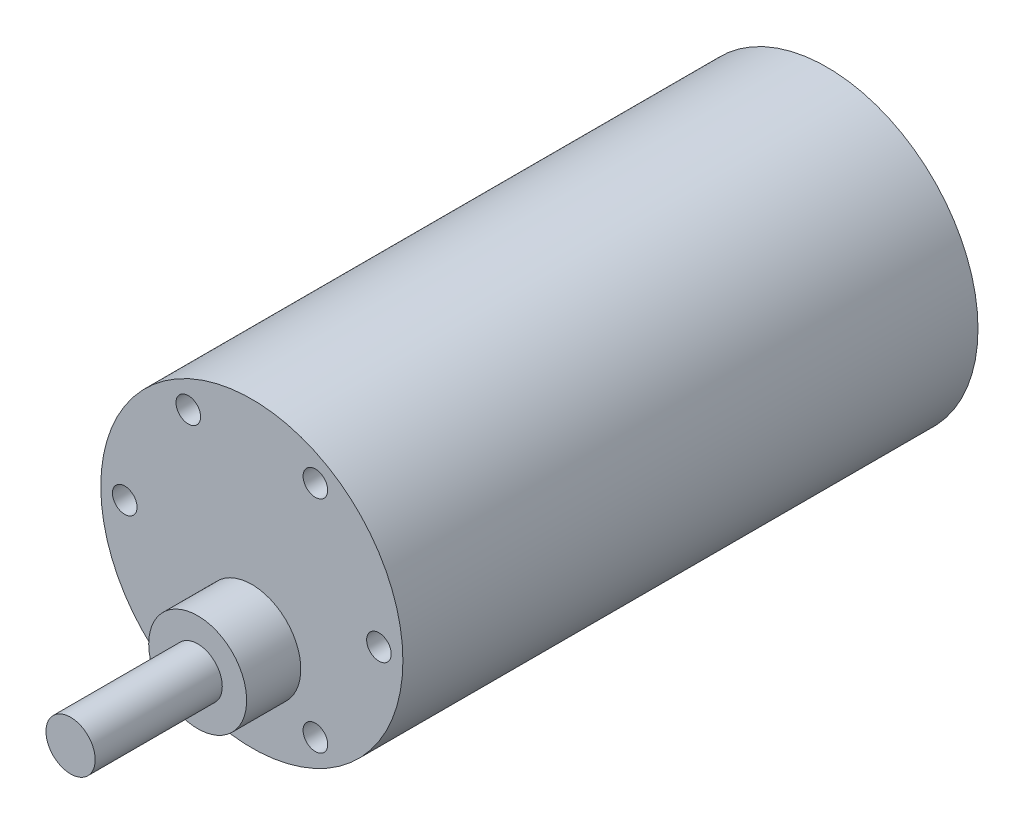
ISO-10303-21;
HEADER;
FILE_DESCRIPTION(('STEP AP214'),'2;1');
FILE_NAME('part.step','',(''),(''),'','','');
FILE_SCHEMA(('AUTOMOTIVE_DESIGN { 1 0 10303 214 1 1 1 1 }'));
ENDSEC;
DATA;
#1=APPLICATION_CONTEXT('core data for automotive mechanical design processes');
#2=APPLICATION_PROTOCOL_DEFINITION('international standard','automotive_design',2000,#1);
#3=PRODUCT_CONTEXT('',#1,'mechanical');
#4=PRODUCT('Part','Part','',(#3));
#5=PRODUCT_RELATED_PRODUCT_CATEGORY('part','',(#4));
#6=PRODUCT_DEFINITION_FORMATION('','',#4);
#7=PRODUCT_DEFINITION_CONTEXT('part definition',#1,'design');
#8=PRODUCT_DEFINITION('design','',#6,#7);
#9=PRODUCT_DEFINITION_SHAPE('','',#8);
#10=(LENGTH_UNIT() NAMED_UNIT(*) SI_UNIT(.MILLI.,.METRE.));
#11=(NAMED_UNIT(*) PLANE_ANGLE_UNIT() SI_UNIT($,.RADIAN.));
#12=(NAMED_UNIT(*) SI_UNIT($,.STERADIAN.) SOLID_ANGLE_UNIT());
#13=UNCERTAINTY_MEASURE_WITH_UNIT(LENGTH_MEASURE(1.E-05),#10,'distance_accuracy_value','');
#14=(GEOMETRIC_REPRESENTATION_CONTEXT(3) GLOBAL_UNCERTAINTY_ASSIGNED_CONTEXT((#13)) GLOBAL_UNIT_ASSIGNED_CONTEXT((#10,
#11,#12)) REPRESENTATION_CONTEXT('',''));
#15=CARTESIAN_POINT('',(0.,0.,0.));
#16=DIRECTION('',(0.,0.,1.));
#17=DIRECTION('',(1.,0.,0.));
#18=AXIS2_PLACEMENT_3D('',#15,#16,#17);
#19=CARTESIAN_POINT('',(0.,0.,70.104));
#20=DIRECTION('',(0.,0.,-1.));
#21=DIRECTION('',(-1.,0.,0.));
#22=AXIS2_PLACEMENT_3D('',#19,#20,#21);
#23=CYLINDRICAL_SURFACE('',#22,18.415);
#24=CARTESIAN_POINT('',(0.,0.,70.104));
#25=DIRECTION('',(0.,0.,1.));
#26=DIRECTION('',(1.,0.,0.));
#27=AXIS2_PLACEMENT_3D('',#24,#25,#26);
#28=CIRCLE('',#27,18.415);
#29=CARTESIAN_POINT('',(18.415,0.,70.104));
#30=VERTEX_POINT('',#29);
#31=EDGE_CURVE('E10',#30,#30,#28,.T.);
#32=ORIENTED_EDGE('',*,*,#31,.F.);
#33=EDGE_LOOP('',(#32));
#34=FACE_BOUND('',#33,.T.);
#35=CARTESIAN_POINT('',(0.,0.,0.));
#36=DIRECTION('',(0.,0.,1.));
#37=DIRECTION('',(1.,0.,0.));
#38=AXIS2_PLACEMENT_3D('',#35,#36,#37);
#39=CIRCLE('',#38,18.415);
#40=CARTESIAN_POINT('',(18.415,0.,0.));
#41=VERTEX_POINT('',#40);
#42=EDGE_CURVE('E34',#41,#41,#39,.T.);
#43=ORIENTED_EDGE('',*,*,#42,.T.);
#44=EDGE_LOOP('',(#43));
#45=FACE_BOUND('',#44,.T.);
#46=ADVANCED_FACE('F31',(#34,#45),#23,.T.);
#47=CARTESIAN_POINT('',(0.,0.,70.104));
#48=DIRECTION('',(0.,0.,1.));
#49=DIRECTION('',(1.,0.,0.));
#50=AXIS2_PLACEMENT_3D('',#47,#48,#49);
#51=PLANE('',#50);
#52=CARTESIAN_POINT('',(7.747,-13.4181976062361,70.104));
#53=DIRECTION('',(0.,0.,1.));
#54=DIRECTION('',(1.,0.,0.));
#55=AXIS2_PLACEMENT_3D('',#52,#53,#54);
#56=CIRCLE('',#55,1.5);
#57=CARTESIAN_POINT('',(9.247,-13.4181976062361,70.104));
#58=VERTEX_POINT('',#57);
#59=EDGE_CURVE('E73',#58,#58,#56,.T.);
#60=ORIENTED_EDGE('',*,*,#59,.F.);
#61=EDGE_LOOP('',(#60));
#62=FACE_BOUND('',#61,.T.);
#63=CARTESIAN_POINT('',(-7.747,-13.4181976062361,70.104));
#64=DIRECTION('',(0.,0.,1.));
#65=DIRECTION('',(1.,0.,0.));
#66=AXIS2_PLACEMENT_3D('',#63,#64,#65);
#67=CIRCLE('',#66,1.5);
#68=CARTESIAN_POINT('',(-6.247,-13.4181976062361,70.104));
#69=VERTEX_POINT('',#68);
#70=EDGE_CURVE('E79',#69,#69,#67,.T.);
#71=ORIENTED_EDGE('',*,*,#70,.F.);
#72=EDGE_LOOP('',(#71));
#73=FACE_BOUND('',#72,.T.);
#74=CARTESIAN_POINT('',(-7.747,13.4181976062361,70.104));
#75=DIRECTION('',(0.,0.,1.));
#76=DIRECTION('',(1.,0.,0.));
#77=AXIS2_PLACEMENT_3D('',#74,#75,#76);
#78=CIRCLE('',#77,1.5);
#79=CARTESIAN_POINT('',(-6.247,13.4181976062361,70.104));
#80=VERTEX_POINT('',#79);
#81=EDGE_CURVE('E85',#80,#80,#78,.T.);
#82=ORIENTED_EDGE('',*,*,#81,.F.);
#83=EDGE_LOOP('',(#82));
#84=FACE_BOUND('',#83,.T.);
#85=CARTESIAN_POINT('',(7.747,13.4181976062361,70.104));
#86=DIRECTION('',(0.,0.,1.));
#87=DIRECTION('',(1.,0.,0.));
#88=AXIS2_PLACEMENT_3D('',#85,#86,#87);
#89=CIRCLE('',#88,1.5);
#90=CARTESIAN_POINT('',(9.247,13.4181976062361,70.104));
#91=VERTEX_POINT('',#90);
#92=EDGE_CURVE('E61',#91,#91,#89,.T.);
#93=ORIENTED_EDGE('',*,*,#92,.F.);
#94=EDGE_LOOP('',(#93));
#95=FACE_BOUND('',#94,.T.);
#96=CARTESIAN_POINT('',(15.494,0.,70.104));
#97=DIRECTION('',(0.,0.,1.));
#98=DIRECTION('',(1.,0.,0.));
#99=AXIS2_PLACEMENT_3D('',#96,#97,#98);
#100=CIRCLE('',#99,1.5);
#101=CARTESIAN_POINT('',(16.994,0.,70.104));
#102=VERTEX_POINT('',#101);
#103=EDGE_CURVE('E68',#102,#102,#100,.T.);
#104=ORIENTED_EDGE('',*,*,#103,.F.);
#105=EDGE_LOOP('',(#104));
#106=FACE_BOUND('',#105,.T.);
#107=CARTESIAN_POINT('',(-15.494,0.,70.104));
#108=DIRECTION('',(0.,0.,1.));
#109=DIRECTION('',(1.,0.,0.));
#110=AXIS2_PLACEMENT_3D('',#107,#108,#109);
#111=CIRCLE('',#110,1.5);
#112=CARTESIAN_POINT('',(-13.994,0.,70.104));
#113=VERTEX_POINT('',#112);
#114=EDGE_CURVE('E55',#113,#113,#111,.T.);
#115=ORIENTED_EDGE('',*,*,#114,.F.);
#116=EDGE_LOOP('',(#115));
#117=FACE_BOUND('',#116,.T.);
#118=CARTESIAN_POINT('',(0.,-7.112,70.104));
#119=DIRECTION('',(0.,0.,1.));
#120=DIRECTION('',(1.,0.,0.));
#121=AXIS2_PLACEMENT_3D('',#118,#119,#120);
#122=CIRCLE('',#121,5.969);
#123=CARTESIAN_POINT('',(-5.969,-7.112,70.104));
#124=VERTEX_POINT('',#123);
#125=EDGE_CURVE('E43',#124,#124,#122,.T.);
#126=ORIENTED_EDGE('',*,*,#125,.F.);
#127=EDGE_LOOP('',(#126));
#128=FACE_BOUND('',#127,.T.);
#129=ORIENTED_EDGE('',*,*,#31,.T.);
#130=EDGE_LOOP('',(#129));
#131=FACE_BOUND('',#130,.T.);
#132=ADVANCED_FACE('F100',(#62,#73,#84,#95,#106,#117,#128,#131),#51,.T.);
#133=CARTESIAN_POINT('',(0.,0.,0.));
#134=DIRECTION('',(0.,0.,1.));
#135=DIRECTION('',(1.,0.,0.));
#136=AXIS2_PLACEMENT_3D('',#133,#134,#135);
#137=PLANE('',#136);
#138=ORIENTED_EDGE('',*,*,#42,.F.);
#139=EDGE_LOOP('',(#138));
#140=FACE_BOUND('',#139,.T.);
#141=ADVANCED_FACE('F103',(#140),#137,.F.);
#142=CARTESIAN_POINT('',(0.,-7.112,76.708));
#143=DIRECTION('',(0.,0.,-1.));
#144=DIRECTION('',(-1.,0.,0.));
#145=AXIS2_PLACEMENT_3D('',#142,#143,#144);
#146=CYLINDRICAL_SURFACE('',#145,5.969);
#147=CARTESIAN_POINT('',(0.,-7.112,76.708));
#148=DIRECTION('',(0.,0.,1.));
#149=DIRECTION('',(1.,0.,0.));
#150=AXIS2_PLACEMENT_3D('',#147,#148,#149);
#151=CIRCLE('',#150,5.969);
#152=CARTESIAN_POINT('',(-5.969,-7.112,76.708));
#153=VERTEX_POINT('',#152);
#154=EDGE_CURVE('E41',#153,#153,#151,.T.);
#155=CARTESIAN_POINT('',(-5.969,-7.112,76.708));
#156=CARTESIAN_POINT('',(-5.969,-7.112,76.6392083333333));
#157=CARTESIAN_POINT('',(-5.969,-7.112,76.5704166666666));
#158=CARTESIAN_POINT('',(-5.969,-7.112,76.4328333333333));
#159=CARTESIAN_POINT('',(-5.969,-7.112,76.3640416666667));
#160=CARTESIAN_POINT('',(-5.969,-7.112,76.2264583333333));
#161=CARTESIAN_POINT('',(-5.969,-7.112,76.1576666666666));
#162=CARTESIAN_POINT('',(-5.969,-7.112,76.0200833333333));
#163=CARTESIAN_POINT('',(-5.969,-7.112,75.9512916666666));
#164=CARTESIAN_POINT('',(-5.969,-7.112,75.8137083333333));
#165=CARTESIAN_POINT('',(-5.969,-7.112,75.7449166666667));
#166=CARTESIAN_POINT('',(-5.969,-7.112,75.6073333333333));
#167=CARTESIAN_POINT('',(-5.969,-7.112,75.5385416666666));
#168=CARTESIAN_POINT('',(-5.969,-7.112,75.4009583333333));
#169=CARTESIAN_POINT('',(-5.969,-7.112,75.3321666666666));
#170=CARTESIAN_POINT('',(-5.969,-7.112,75.1945833333333));
#171=CARTESIAN_POINT('',(-5.969,-7.112,75.1257916666666));
#172=CARTESIAN_POINT('',(-5.969,-7.112,74.9882083333333));
#173=CARTESIAN_POINT('',(-5.969,-7.112,74.9194166666666));
#174=CARTESIAN_POINT('',(-5.969,-7.112,74.7818333333333));
#175=CARTESIAN_POINT('',(-5.969,-7.112,74.7130416666666));
#176=CARTESIAN_POINT('',(-5.969,-7.112,74.5754583333333));
#177=CARTESIAN_POINT('',(-5.969,-7.112,74.5066666666666));
#178=CARTESIAN_POINT('',(-5.969,-7.112,74.3690833333333));
#179=CARTESIAN_POINT('',(-5.969,-7.112,74.3002916666666));
#180=CARTESIAN_POINT('',(-5.969,-7.112,74.1627083333333));
#181=CARTESIAN_POINT('',(-5.969,-7.112,74.0939166666666));
#182=CARTESIAN_POINT('',(-5.969,-7.112,73.9563333333333));
#183=CARTESIAN_POINT('',(-5.969,-7.112,73.8875416666666));
#184=CARTESIAN_POINT('',(-5.969,-7.112,73.7499583333333));
#185=CARTESIAN_POINT('',(-5.969,-7.112,73.6811666666666));
#186=CARTESIAN_POINT('',(-5.969,-7.112,73.5435833333333));
#187=CARTESIAN_POINT('',(-5.969,-7.112,73.4747916666666));
#188=CARTESIAN_POINT('',(-5.969,-7.112,73.3372083333333));
#189=CARTESIAN_POINT('',(-5.969,-7.112,73.2684166666666));
#190=CARTESIAN_POINT('',(-5.969,-7.112,73.1308333333333));
#191=CARTESIAN_POINT('',(-5.969,-7.112,73.0620416666666));
#192=CARTESIAN_POINT('',(-5.969,-7.112,72.9244583333333));
#193=CARTESIAN_POINT('',(-5.969,-7.112,72.8556666666666));
#194=CARTESIAN_POINT('',(-5.969,-7.112,72.7180833333333));
#195=CARTESIAN_POINT('',(-5.969,-7.112,72.6492916666666));
#196=CARTESIAN_POINT('',(-5.969,-7.112,72.5117083333333));
#197=CARTESIAN_POINT('',(-5.969,-7.112,72.4429166666666));
#198=CARTESIAN_POINT('',(-5.969,-7.112,72.3053333333333));
#199=CARTESIAN_POINT('',(-5.969,-7.112,72.2365416666666));
#200=CARTESIAN_POINT('',(-5.969,-7.112,72.0989583333333));
#201=CARTESIAN_POINT('',(-5.969,-7.112,72.0301666666666));
#202=CARTESIAN_POINT('',(-5.969,-7.112,71.8925833333333));
#203=CARTESIAN_POINT('',(-5.969,-7.112,71.8237916666667));
#204=CARTESIAN_POINT('',(-5.969,-7.112,71.6862083333333));
#205=CARTESIAN_POINT('',(-5.969,-7.112,71.6174166666666));
#206=CARTESIAN_POINT('',(-5.969,-7.112,71.4798333333333));
#207=CARTESIAN_POINT('',(-5.969,-7.112,71.4110416666666));
#208=CARTESIAN_POINT('',(-5.969,-7.112,71.2734583333333));
#209=CARTESIAN_POINT('',(-5.969,-7.112,71.2046666666666));
#210=CARTESIAN_POINT('',(-5.969,-7.112,71.0670833333333));
#211=CARTESIAN_POINT('',(-5.969,-7.112,70.9982916666666));
#212=CARTESIAN_POINT('',(-5.969,-7.112,70.8607083333333));
#213=CARTESIAN_POINT('',(-5.969,-7.112,70.7919166666667));
#214=CARTESIAN_POINT('',(-5.969,-7.112,70.6543333333333));
#215=CARTESIAN_POINT('',(-5.969,-7.112,70.5855416666666));
#216=CARTESIAN_POINT('',(-5.969,-7.112,70.4479583333333));
#217=CARTESIAN_POINT('',(-5.969,-7.112,70.3791666666666));
#218=CARTESIAN_POINT('',(-5.969,-7.112,70.2415833333333));
#219=CARTESIAN_POINT('',(-5.969,-7.112,70.1727916666667));
#220=CARTESIAN_POINT('',(-5.969,-7.112,70.104));
#221=B_SPLINE_CURVE_WITH_KNOTS('',3,(#155,#156,#157,#158,#159,#160,#161,#162,#163,#164,#165,
#166,#167,#168,#169,#170,#171,#172,#173,#174,#175,#176,#177,#178,#179,#180,#181,#182,#183,#184,
#185,#186,#187,#188,#189,#190,#191,#192,#193,#194,#195,#196,#197,#198,#199,#200,#201,#202,#203,
#204,#205,#206,#207,#208,#209,#210,#211,#212,#213,#214,#215,#216,#217,#218,#219,#220),
.UNSPECIFIED.,.F.,.F.,(4,2,2,2,2,2,2,2,2,2,2,2,2,2,2,2,2,2,2,2,2,2,2,2,2,2,2,2,2,2,2,2,4),(0.,
0.206375000000009,0.412750000000003,0.619125000000012,0.825500000000007,1.031875,
1.23825000000001,1.444625,1.651,1.85737500000001,2.06375,2.27012500000001,2.47650000000001,
2.682875,2.88925000000001,3.095625,3.302,3.50837500000001,3.71475,3.92112500000001,
4.12750000000001,4.333875,4.54025000000001,4.746625,4.953,5.15937500000001,5.36575,
5.57212500000001,5.77850000000001,5.984875,6.19125000000001,6.397625,6.604),.UNSPECIFIED.);
#222=EDGE_CURVE('BSEAM114',#153,#124,#221,.T.);
#223=ORIENTED_EDGE('',*,*,#154,.F.);
#224=ORIENTED_EDGE('',*,*,#125,.T.);
#225=ORIENTED_EDGE('',*,*,#222,.T.);
#226=ORIENTED_EDGE('',*,*,#222,.F.);
#227=EDGE_LOOP('',(#223,#225,#224,#226));
#228=FACE_BOUND('',#227,.T.);
#229=ADVANCED_FACE('F114',(#228),#146,.T.);
#230=CARTESIAN_POINT('',(0.,-7.112,76.708));
#231=DIRECTION('',(0.,0.,1.));
#232=DIRECTION('',(1.,0.,0.));
#233=AXIS2_PLACEMENT_3D('',#230,#231,#232);
#234=PLANE('',#233);
#235=CARTESIAN_POINT('',(0.,-7.112,76.708));
#236=DIRECTION('',(0.,0.,1.));
#237=DIRECTION('',(1.,0.,0.));
#238=AXIS2_PLACEMENT_3D('',#235,#236,#237);
#239=CIRCLE('',#238,3.);
#240=CARTESIAN_POINT('',(3.,-7.112,76.708));
#241=VERTEX_POINT('',#240);
#242=EDGE_CURVE('E49',#241,#241,#239,.T.);
#243=ORIENTED_EDGE('',*,*,#242,.F.);
#244=EDGE_LOOP('',(#243));
#245=FACE_BOUND('',#244,.T.);
#246=ORIENTED_EDGE('',*,*,#154,.T.);
#247=EDGE_LOOP('',(#246));
#248=FACE_BOUND('',#247,.T.);
#249=ADVANCED_FACE('F116',(#245,#248),#234,.T.);
#250=CARTESIAN_POINT('',(0.,-7.112,92.202));
#251=DIRECTION('',(0.,0.,-1.));
#252=DIRECTION('',(-1.,0.,0.));
#253=AXIS2_PLACEMENT_3D('',#250,#251,#252);
#254=CYLINDRICAL_SURFACE('',#253,3.);
#255=CARTESIAN_POINT('',(0.,-7.112,92.202));
#256=DIRECTION('',(0.,0.,1.));
#257=DIRECTION('',(1.,0.,0.));
#258=AXIS2_PLACEMENT_3D('',#255,#256,#257);
#259=CIRCLE('',#258,3.);
#260=CARTESIAN_POINT('',(3.,-7.112,92.202));
#261=VERTEX_POINT('',#260);
#262=EDGE_CURVE('E46',#261,#261,#259,.T.);
#263=ORIENTED_EDGE('',*,*,#262,.F.);
#264=EDGE_LOOP('',(#263));
#265=FACE_BOUND('',#264,.T.);
#266=ORIENTED_EDGE('',*,*,#242,.T.);
#267=EDGE_LOOP('',(#266));
#268=FACE_BOUND('',#267,.T.);
#269=ADVANCED_FACE('F123',(#265,#268),#254,.T.);
#270=CARTESIAN_POINT('',(0.,-7.112,92.202));
#271=DIRECTION('',(0.,0.,1.));
#272=DIRECTION('',(1.,0.,0.));
#273=AXIS2_PLACEMENT_3D('',#270,#271,#272);
#274=PLANE('',#273);
#275=ORIENTED_EDGE('',*,*,#262,.T.);
#276=EDGE_LOOP('',(#275));
#277=FACE_BOUND('',#276,.T.);
#278=ADVANCED_FACE('F162',(#277),#274,.T.);
#279=CARTESIAN_POINT('',(-15.494,0.,44.704));
#280=DIRECTION('',(0.,0.,1.));
#281=DIRECTION('',(1.,0.,0.));
#282=AXIS2_PLACEMENT_3D('',#279,#280,#281);
#283=CYLINDRICAL_SURFACE('',#282,1.5);
#284=CARTESIAN_POINT('',(-15.494,0.,44.704));
#285=DIRECTION('',(0.,0.,1.));
#286=DIRECTION('',(1.,0.,0.));
#287=AXIS2_PLACEMENT_3D('',#284,#285,#286);
#288=CIRCLE('',#287,1.5);
#289=CARTESIAN_POINT('',(-13.994,0.,44.704));
#290=VERTEX_POINT('',#289);
#291=EDGE_CURVE('E52',#290,#290,#288,.T.);
#292=ORIENTED_EDGE('',*,*,#291,.F.);
#293=EDGE_LOOP('',(#292));
#294=FACE_BOUND('',#293,.T.);
#295=ORIENTED_EDGE('',*,*,#114,.T.);
#296=EDGE_LOOP('',(#295));
#297=FACE_BOUND('',#296,.T.);
#298=ADVANCED_FACE('F171',(#294,#297),#283,.F.);
#299=CARTESIAN_POINT('',(-15.494,0.,44.704));
#300=DIRECTION('',(0.,0.,1.));
#301=DIRECTION('',(1.,0.,0.));
#302=AXIS2_PLACEMENT_3D('',#299,#300,#301);
#303=PLANE('',#302);
#304=ORIENTED_EDGE('',*,*,#291,.T.);
#305=EDGE_LOOP('',(#304));
#306=FACE_BOUND('',#305,.T.);
#307=ADVANCED_FACE('F181',(#306),#303,.T.);
#308=CARTESIAN_POINT('',(15.494,0.,44.704));
#309=DIRECTION('',(0.,0.,1.));
#310=DIRECTION('',(1.,0.,0.));
#311=AXIS2_PLACEMENT_3D('',#308,#309,#310);
#312=CYLINDRICAL_SURFACE('',#311,1.5);
#313=CARTESIAN_POINT('',(15.494,0.,44.704));
#314=DIRECTION('',(0.,0.,1.));
#315=DIRECTION('',(1.,0.,0.));
#316=AXIS2_PLACEMENT_3D('',#313,#314,#315);
#317=CIRCLE('',#316,1.5);
#318=CARTESIAN_POINT('',(16.994,0.,44.704));
#319=VERTEX_POINT('',#318);
#320=EDGE_CURVE('E58',#319,#319,#317,.T.);
#321=ORIENTED_EDGE('',*,*,#320,.F.);
#322=EDGE_LOOP('',(#321));
#323=FACE_BOUND('',#322,.T.);
#324=ORIENTED_EDGE('',*,*,#103,.T.);
#325=EDGE_LOOP('',(#324));
#326=FACE_BOUND('',#325,.T.);
#327=ADVANCED_FACE('F188',(#323,#326),#312,.F.);
#328=CARTESIAN_POINT('',(15.494,0.,44.704));
#329=DIRECTION('',(0.,0.,1.));
#330=DIRECTION('',(1.,0.,0.));
#331=AXIS2_PLACEMENT_3D('',#328,#329,#330);
#332=PLANE('',#331);
#333=ORIENTED_EDGE('',*,*,#320,.T.);
#334=EDGE_LOOP('',(#333));
#335=FACE_BOUND('',#334,.T.);
#336=ADVANCED_FACE('F196',(#335),#332,.T.);
#337=CARTESIAN_POINT('',(7.747,13.4181976062361,44.704));
#338=DIRECTION('',(0.,0.,1.));
#339=DIRECTION('',(1.,0.,0.));
#340=AXIS2_PLACEMENT_3D('',#337,#338,#339);
#341=CYLINDRICAL_SURFACE('',#340,1.5);
#342=CARTESIAN_POINT('',(7.747,13.4181976062361,44.704));
#343=DIRECTION('',(0.,0.,1.));
#344=DIRECTION('',(1.,0.,0.));
#345=AXIS2_PLACEMENT_3D('',#342,#343,#344);
#346=CIRCLE('',#345,1.5);
#347=CARTESIAN_POINT('',(9.247,13.4181976062361,44.704));
#348=VERTEX_POINT('',#347);
#349=EDGE_CURVE('E64',#348,#348,#346,.T.);
#350=ORIENTED_EDGE('',*,*,#349,.F.);
#351=EDGE_LOOP('',(#350));
#352=FACE_BOUND('',#351,.T.);
#353=ORIENTED_EDGE('',*,*,#92,.T.);
#354=EDGE_LOOP('',(#353));
#355=FACE_BOUND('',#354,.T.);
#356=ADVANCED_FACE('F204',(#352,#355),#341,.F.);
#357=CARTESIAN_POINT('',(7.747,13.4181976062361,44.704));
#358=DIRECTION('',(0.,0.,1.));
#359=DIRECTION('',(1.,0.,0.));
#360=AXIS2_PLACEMENT_3D('',#357,#358,#359);
#361=PLANE('',#360);
#362=ORIENTED_EDGE('',*,*,#349,.T.);
#363=EDGE_LOOP('',(#362));
#364=FACE_BOUND('',#363,.T.);
#365=ADVANCED_FACE('F96',(#364),#361,.T.);
#366=CARTESIAN_POINT('',(-7.747,13.4181976062361,44.704));
#367=DIRECTION('',(0.,0.,1.));
#368=DIRECTION('',(1.,0.,0.));
#369=AXIS2_PLACEMENT_3D('',#366,#367,#368);
#370=CYLINDRICAL_SURFACE('',#369,1.5);
#371=CARTESIAN_POINT('',(-7.747,13.4181976062361,44.704));
#372=DIRECTION('',(0.,0.,1.));
#373=DIRECTION('',(1.,0.,0.));
#374=AXIS2_PLACEMENT_3D('',#371,#372,#373);
#375=CIRCLE('',#374,1.5);
#376=CARTESIAN_POINT('',(-6.247,13.4181976062361,44.704));
#377=VERTEX_POINT('',#376);
#378=EDGE_CURVE('E65',#377,#377,#375,.T.);
#379=ORIENTED_EDGE('',*,*,#378,.F.);
#380=EDGE_LOOP('',(#379));
#381=FACE_BOUND('',#380,.T.);
#382=ORIENTED_EDGE('',*,*,#81,.T.);
#383=EDGE_LOOP('',(#382));
#384=FACE_BOUND('',#383,.T.);
#385=ADVANCED_FACE('F93',(#381,#384),#370,.F.);
#386=CARTESIAN_POINT('',(-7.747,13.4181976062361,44.704));
#387=DIRECTION('',(0.,0.,1.));
#388=DIRECTION('',(1.,0.,0.));
#389=AXIS2_PLACEMENT_3D('',#386,#387,#388);
#390=PLANE('',#389);
#391=ORIENTED_EDGE('',*,*,#378,.T.);
#392=EDGE_LOOP('',(#391));
#393=FACE_BOUND('',#392,.T.);
#394=ADVANCED_FACE('F91',(#393),#390,.T.);
#395=CARTESIAN_POINT('',(-7.747,-13.4181976062361,44.704));
#396=DIRECTION('',(0.,0.,1.));
#397=DIRECTION('',(1.,0.,0.));
#398=AXIS2_PLACEMENT_3D('',#395,#396,#397);
#399=CYLINDRICAL_SURFACE('',#398,1.5);
#400=CARTESIAN_POINT('',(-7.747,-13.4181976062361,44.704));
#401=DIRECTION('',(0.,0.,1.));
#402=DIRECTION('',(1.,0.,0.));
#403=AXIS2_PLACEMENT_3D('',#400,#401,#402);
#404=CIRCLE('',#403,1.5);
#405=CARTESIAN_POINT('',(-6.247,-13.4181976062361,44.704));
#406=VERTEX_POINT('',#405);
#407=EDGE_CURVE('E82',#406,#406,#404,.T.);
#408=ORIENTED_EDGE('',*,*,#407,.F.);
#409=EDGE_LOOP('',(#408));
#410=FACE_BOUND('',#409,.T.);
#411=ORIENTED_EDGE('',*,*,#70,.T.);
#412=EDGE_LOOP('',(#411));
#413=FACE_BOUND('',#412,.T.);
#414=ADVANCED_FACE('F230',(#410,#413),#399,.F.);
#415=CARTESIAN_POINT('',(-7.747,-13.4181976062361,44.704));
#416=DIRECTION('',(0.,0.,1.));
#417=DIRECTION('',(1.,0.,0.));
#418=AXIS2_PLACEMENT_3D('',#415,#416,#417);
#419=PLANE('',#418);
#420=ORIENTED_EDGE('',*,*,#407,.T.);
#421=EDGE_LOOP('',(#420));
#422=FACE_BOUND('',#421,.T.);
#423=ADVANCED_FACE('F237',(#422),#419,.T.);
#424=CARTESIAN_POINT('',(7.747,-13.4181976062361,44.704));
#425=DIRECTION('',(0.,0.,1.));
#426=DIRECTION('',(1.,0.,0.));
#427=AXIS2_PLACEMENT_3D('',#424,#425,#426);
#428=CYLINDRICAL_SURFACE('',#427,1.5);
#429=CARTESIAN_POINT('',(7.747,-13.4181976062361,44.704));
#430=DIRECTION('',(0.,0.,1.));
#431=DIRECTION('',(1.,0.,0.));
#432=AXIS2_PLACEMENT_3D('',#429,#430,#431);
#433=CIRCLE('',#432,1.5);
#434=CARTESIAN_POINT('',(9.247,-13.4181976062361,44.704));
#435=VERTEX_POINT('',#434);
#436=EDGE_CURVE('E76',#435,#435,#433,.T.);
#437=ORIENTED_EDGE('',*,*,#436,.F.);
#438=EDGE_LOOP('',(#437));
#439=FACE_BOUND('',#438,.T.);
#440=ORIENTED_EDGE('',*,*,#59,.T.);
#441=EDGE_LOOP('',(#440));
#442=FACE_BOUND('',#441,.T.);
#443=ADVANCED_FACE('F245',(#439,#442),#428,.F.);
#444=CARTESIAN_POINT('',(7.747,-13.4181976062361,44.704));
#445=DIRECTION('',(0.,0.,1.));
#446=DIRECTION('',(1.,0.,0.));
#447=AXIS2_PLACEMENT_3D('',#444,#445,#446);
#448=PLANE('',#447);
#449=ORIENTED_EDGE('',*,*,#436,.T.);
#450=EDGE_LOOP('',(#449));
#451=FACE_BOUND('',#450,.T.);
#452=ADVANCED_FACE('F253',(#451),#448,.T.);
#453=CLOSED_SHELL('',(#46,#132,#141,#229,#249,#269,#278,#298,#307,#327,#336,#356,#365,#385,#394,
#414,#423,#443,#452));
#454=MANIFOLD_SOLID_BREP('B2',#453);
#455=ADVANCED_BREP_SHAPE_REPRESENTATION('',(#18,#454),#14);
#456=SHAPE_DEFINITION_REPRESENTATION(#9,#455);
ENDSEC;
END-ISO-10303-21;
